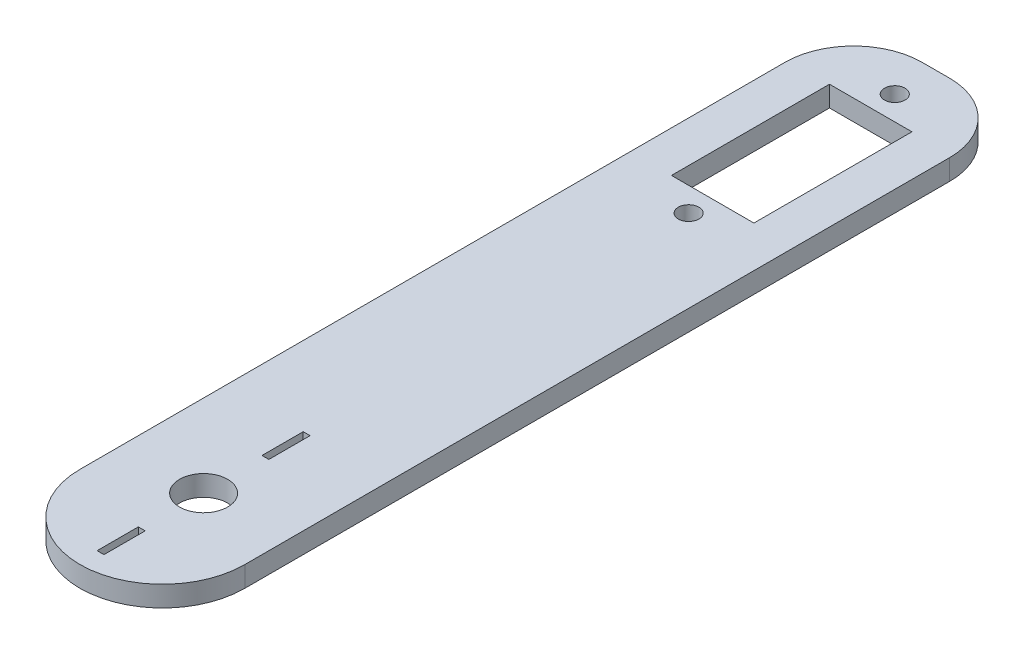
ISO-10303-21;
HEADER;
FILE_DESCRIPTION(('STEP AP214'),'2;1');
FILE_NAME('part.step','',(''),(''),'','','');
FILE_SCHEMA(('AUTOMOTIVE_DESIGN { 1 0 10303 214 1 1 1 1 }'));
ENDSEC;
DATA;
#1=APPLICATION_CONTEXT('core data for automotive mechanical design processes');
#2=APPLICATION_PROTOCOL_DEFINITION('international standard','automotive_design',2000,#1);
#3=PRODUCT_CONTEXT('',#1,'mechanical');
#4=PRODUCT('Part','Part','',(#3));
#5=PRODUCT_RELATED_PRODUCT_CATEGORY('part','',(#4));
#6=PRODUCT_DEFINITION_FORMATION('','',#4);
#7=PRODUCT_DEFINITION_CONTEXT('part definition',#1,'design');
#8=PRODUCT_DEFINITION('design','',#6,#7);
#9=PRODUCT_DEFINITION_SHAPE('','',#8);
#10=(LENGTH_UNIT() NAMED_UNIT(*) SI_UNIT(.MILLI.,.METRE.));
#11=(NAMED_UNIT(*) PLANE_ANGLE_UNIT() SI_UNIT($,.RADIAN.));
#12=(NAMED_UNIT(*) SI_UNIT($,.STERADIAN.) SOLID_ANGLE_UNIT());
#13=UNCERTAINTY_MEASURE_WITH_UNIT(LENGTH_MEASURE(1.E-05),#10,'distance_accuracy_value','');
#14=(GEOMETRIC_REPRESENTATION_CONTEXT(3) GLOBAL_UNCERTAINTY_ASSIGNED_CONTEXT((#13)) GLOBAL_UNIT_ASSIGNED_CONTEXT((#10,
#11,#12)) REPRESENTATION_CONTEXT('',''));
#15=CARTESIAN_POINT('',(0.,0.,0.));
#16=DIRECTION('',(0.,0.,1.));
#17=DIRECTION('',(1.,0.,0.));
#18=AXIS2_PLACEMENT_3D('',#15,#16,#17);
#19=CARTESIAN_POINT('',(-1.98737259774585,3.,-93.9666133181393));
#20=DIRECTION('',(0.,-1.,0.));
#21=DIRECTION('',(0.,0.,-1.));
#22=AXIS2_PLACEMENT_3D('',#19,#20,#21);
#23=CYLINDRICAL_SURFACE('',#22,9.99999999999995);
#24=CARTESIAN_POINT('',(-1.98737259774585,0.,-93.9666133181393));
#25=DIRECTION('',(0.,1.,0.));
#26=DIRECTION('',(0.,0.,1.));
#27=AXIS2_PLACEMENT_3D('',#24,#25,#26);
#28=CIRCLE('',#27,9.99999999999995);
#29=CARTESIAN_POINT('',(-11.9873725977458,0.,-93.9666133181393));
#30=VERTEX_POINT('',#29);
#31=CARTESIAN_POINT('',(-1.98737259774585,0.,-103.966613318139));
#32=VERTEX_POINT('',#31);
#33=EDGE_CURVE('E242',#30,#32,#28,.F.);
#34=ORIENTED_EDGE('',*,*,#33,.F.);
#35=DIRECTION('',(0.,-1.,0.));
#36=VECTOR('',#35,1.);
#37=CARTESIAN_POINT('',(-11.9873725977458,3.,-93.9666133181393));
#38=LINE('',#37,#36);
#39=CARTESIAN_POINT('',(-11.9873725977458,3.,-93.9666133181393));
#40=VERTEX_POINT('',#39);
#41=EDGE_CURVE('E11',#40,#30,#38,.T.);
#42=ORIENTED_EDGE('',*,*,#41,.F.);
#43=CARTESIAN_POINT('',(-1.98737259774585,3.,-93.9666133181393));
#44=DIRECTION('',(0.,1.,0.));
#45=DIRECTION('',(0.,0.,1.));
#46=AXIS2_PLACEMENT_3D('',#43,#44,#45);
#47=CIRCLE('',#46,9.99999999999995);
#48=CARTESIAN_POINT('',(-1.98737259774585,3.,-103.966613318139));
#49=VERTEX_POINT('',#48);
#50=EDGE_CURVE('E335',#40,#49,#47,.F.);
#51=ORIENTED_EDGE('',*,*,#50,.T.);
#52=DIRECTION('',(0.,-1.,0.));
#53=VECTOR('',#52,1.);
#54=CARTESIAN_POINT('',(-1.98737259774585,3.,-103.966613318139));
#55=LINE('',#54,#53);
#56=EDGE_CURVE('E55',#49,#32,#55,.T.);
#57=ORIENTED_EDGE('',*,*,#56,.T.);
#58=EDGE_LOOP('',(#34,#42,#51,#57));
#59=FACE_BOUND('',#58,.T.);
#60=ADVANCED_FACE('F36',(#59),#23,.T.);
#61=CARTESIAN_POINT('',(-11.9873725977458,3.,0.));
#62=DIRECTION('',(-1.,0.,0.));
#63=DIRECTION('',(0.,0.,1.));
#64=AXIS2_PLACEMENT_3D('',#61,#62,#63);
#65=PLANE('',#64);
#66=DIRECTION('',(0.,0.,-1.));
#67=VECTOR('',#66,1.);
#68=CARTESIAN_POINT('',(-11.9873725977458,0.,0.));
#69=LINE('',#68,#67);
#70=CARTESIAN_POINT('',(-11.9873725977458,0.,8.63338668188863));
#71=VERTEX_POINT('',#70);
#72=EDGE_CURVE('E244',#71,#30,#69,.T.);
#73=ORIENTED_EDGE('',*,*,#72,.F.);
#74=DIRECTION('',(0.,-1.,0.));
#75=VECTOR('',#74,1.);
#76=CARTESIAN_POINT('',(-11.9873725977458,3.,8.63338668188863));
#77=LINE('',#76,#75);
#78=CARTESIAN_POINT('',(-11.9873725977458,3.,8.63338668188863));
#79=VERTEX_POINT('',#78);
#80=EDGE_CURVE('E46',#79,#71,#77,.T.);
#81=ORIENTED_EDGE('',*,*,#80,.F.);
#82=DIRECTION('',(0.,0.,-1.));
#83=VECTOR('',#82,1.);
#84=CARTESIAN_POINT('',(-11.9873725977458,3.,0.));
#85=LINE('',#84,#83);
#86=EDGE_CURVE('E194',#79,#40,#85,.T.);
#87=ORIENTED_EDGE('',*,*,#86,.T.);
#88=ORIENTED_EDGE('',*,*,#41,.T.);
#89=EDGE_LOOP('',(#73,#81,#87,#88));
#90=FACE_BOUND('',#89,.T.);
#91=ADVANCED_FACE('F339',(#90),#65,.T.);
#92=CARTESIAN_POINT('',(0.0126274022262289,3.,8.63338668188863));
#93=DIRECTION('',(0.,-1.,0.));
#94=DIRECTION('',(0.,0.,-1.));
#95=AXIS2_PLACEMENT_3D('',#92,#93,#94);
#96=CYLINDRICAL_SURFACE('',#95,11.999999999972);
#97=CARTESIAN_POINT('',(0.0126274022262289,0.,8.63338668188863));
#98=DIRECTION('',(0.,1.,0.));
#99=DIRECTION('',(0.,0.,1.));
#100=AXIS2_PLACEMENT_3D('',#97,#98,#99);
#101=CIRCLE('',#100,11.999999999972);
#102=CARTESIAN_POINT('',(12.0126274021983,0.,8.63338668188863));
#103=VERTEX_POINT('',#102);
#104=EDGE_CURVE('E247',#71,#103,#101,.T.);
#105=ORIENTED_EDGE('',*,*,#104,.T.);
#106=DIRECTION('',(0.,-1.,0.));
#107=VECTOR('',#106,1.);
#108=CARTESIAN_POINT('',(12.0126274021983,3.,8.63338668188863));
#109=LINE('',#108,#107);
#110=CARTESIAN_POINT('',(12.0126274021983,3.,8.63338668188863));
#111=VERTEX_POINT('',#110);
#112=EDGE_CURVE('E178',#111,#103,#109,.T.);
#113=ORIENTED_EDGE('',*,*,#112,.F.);
#114=CARTESIAN_POINT('',(0.0126274022262289,3.,8.63338668188863));
#115=DIRECTION('',(0.,1.,0.));
#116=DIRECTION('',(0.,0.,1.));
#117=AXIS2_PLACEMENT_3D('',#114,#115,#116);
#118=CIRCLE('',#117,11.999999999972);
#119=EDGE_CURVE('E191',#79,#111,#118,.T.);
#120=ORIENTED_EDGE('',*,*,#119,.F.);
#121=ORIENTED_EDGE('',*,*,#80,.T.);
#122=EDGE_LOOP('',(#105,#113,#120,#121));
#123=FACE_BOUND('',#122,.T.);
#124=ADVANCED_FACE('F344',(#123),#96,.T.);
#125=CARTESIAN_POINT('',(12.0126274021983,3.,0.));
#126=DIRECTION('',(1.,0.,0.));
#127=DIRECTION('',(0.,0.,-1.));
#128=AXIS2_PLACEMENT_3D('',#125,#126,#127);
#129=PLANE('',#128);
#130=DIRECTION('',(0.,0.,1.));
#131=VECTOR('',#130,1.);
#132=CARTESIAN_POINT('',(12.0126274021983,0.,0.));
#133=LINE('',#132,#131);
#134=CARTESIAN_POINT('',(12.0126274021983,0.,-93.9666133181393));
#135=VERTEX_POINT('',#134);
#136=EDGE_CURVE('E175',#135,#103,#133,.T.);
#137=ORIENTED_EDGE('',*,*,#136,.F.);
#138=DIRECTION('',(0.,-1.,0.));
#139=VECTOR('',#138,1.);
#140=CARTESIAN_POINT('',(12.0126274021983,3.,-93.9666133181393));
#141=LINE('',#140,#139);
#142=CARTESIAN_POINT('',(12.0126274021983,3.,-93.9666133181393));
#143=VERTEX_POINT('',#142);
#144=EDGE_CURVE('E169',#143,#135,#141,.T.);
#145=ORIENTED_EDGE('',*,*,#144,.F.);
#146=DIRECTION('',(0.,0.,1.));
#147=VECTOR('',#146,1.);
#148=CARTESIAN_POINT('',(12.0126274021983,3.,0.));
#149=LINE('',#148,#147);
#150=EDGE_CURVE('E173',#143,#111,#149,.T.);
#151=ORIENTED_EDGE('',*,*,#150,.T.);
#152=ORIENTED_EDGE('',*,*,#112,.T.);
#153=EDGE_LOOP('',(#137,#145,#151,#152));
#154=FACE_BOUND('',#153,.T.);
#155=ADVANCED_FACE('F171',(#154),#129,.T.);
#156=CARTESIAN_POINT('',(2.01262740219831,3.,-93.9666133181393));
#157=DIRECTION('',(0.,-1.,0.));
#158=DIRECTION('',(0.,0.,-1.));
#159=AXIS2_PLACEMENT_3D('',#156,#157,#158);
#160=CYLINDRICAL_SURFACE('',#159,9.99999999999995);
#161=CARTESIAN_POINT('',(2.01262740219831,0.,-93.9666133181393));
#162=DIRECTION('',(0.,1.,0.));
#163=DIRECTION('',(0.,0.,1.));
#164=AXIS2_PLACEMENT_3D('',#161,#162,#163);
#165=CIRCLE('',#164,9.99999999999995);
#166=CARTESIAN_POINT('',(2.01262740219831,0.,-103.966613318139));
#167=VERTEX_POINT('',#166);
#168=EDGE_CURVE('E251',#135,#167,#165,.T.);
#169=ORIENTED_EDGE('',*,*,#168,.T.);
#170=DIRECTION('',(0.,-1.,0.));
#171=VECTOR('',#170,1.);
#172=CARTESIAN_POINT('',(2.01262740219831,3.,-103.966613318139));
#173=LINE('',#172,#171);
#174=CARTESIAN_POINT('',(2.01262740219831,3.,-103.966613318139));
#175=VERTEX_POINT('',#174);
#176=EDGE_CURVE('E111',#175,#167,#173,.T.);
#177=ORIENTED_EDGE('',*,*,#176,.F.);
#178=CARTESIAN_POINT('',(2.01262740219831,3.,-93.9666133181393));
#179=DIRECTION('',(0.,1.,0.));
#180=DIRECTION('',(0.,0.,1.));
#181=AXIS2_PLACEMENT_3D('',#178,#179,#180);
#182=CIRCLE('',#181,9.99999999999995);
#183=EDGE_CURVE('E180',#143,#175,#182,.T.);
#184=ORIENTED_EDGE('',*,*,#183,.F.);
#185=ORIENTED_EDGE('',*,*,#144,.T.);
#186=EDGE_LOOP('',(#169,#177,#184,#185));
#187=FACE_BOUND('',#186,.T.);
#188=ADVANCED_FACE('F181',(#187),#160,.T.);
#189=CARTESIAN_POINT('',(0.512627402254318,3.,0.));
#190=DIRECTION('',(1.,0.,0.));
#191=DIRECTION('',(0.,0.,-1.));
#192=AXIS2_PLACEMENT_3D('',#189,#190,#191);
#193=PLANE('',#192);
#194=DIRECTION('',(0.,0.,1.));
#195=VECTOR('',#194,1.);
#196=CARTESIAN_POINT('',(0.512627402254318,0.,0.));
#197=LINE('',#196,#195);
#198=CARTESIAN_POINT('',(0.512627402254318,0.,11.6333866818607));
#199=VERTEX_POINT('',#198);
#200=CARTESIAN_POINT('',(0.512627402254318,0.,17.6333866818607));
#201=VERTEX_POINT('',#200);
#202=EDGE_CURVE('E233',#199,#201,#197,.T.);
#203=ORIENTED_EDGE('',*,*,#202,.T.);
#204=DIRECTION('',(0.,-1.,0.));
#205=VECTOR('',#204,1.);
#206=CARTESIAN_POINT('',(0.512627402254318,3.,17.6333866818607));
#207=LINE('',#206,#205);
#208=CARTESIAN_POINT('',(0.512627402254318,3.,17.6333866818607));
#209=VERTEX_POINT('',#208);
#210=EDGE_CURVE('E261',#209,#201,#207,.T.);
#211=ORIENTED_EDGE('',*,*,#210,.F.);
#212=DIRECTION('',(0.,0.,1.));
#213=VECTOR('',#212,1.);
#214=CARTESIAN_POINT('',(0.512627402254318,3.,0.));
#215=LINE('',#214,#213);
#216=CARTESIAN_POINT('',(0.512627402254318,3.,11.6333866818607));
#217=VERTEX_POINT('',#216);
#218=EDGE_CURVE('E326',#217,#209,#215,.T.);
#219=ORIENTED_EDGE('',*,*,#218,.F.);
#220=DIRECTION('',(0.,-1.,0.));
#221=VECTOR('',#220,1.);
#222=CARTESIAN_POINT('',(0.512627402254318,3.,11.6333866818607));
#223=LINE('',#222,#221);
#224=EDGE_CURVE('E265',#217,#199,#223,.T.);
#225=ORIENTED_EDGE('',*,*,#224,.T.);
#226=EDGE_LOOP('',(#203,#211,#219,#225));
#227=FACE_BOUND('',#226,.T.);
#228=ADVANCED_FACE('F372',(#227),#193,.F.);
#229=CARTESIAN_POINT('',(0.,3.,17.6333866818607));
#230=DIRECTION('',(0.,0.,1.));
#231=DIRECTION('',(1.,0.,0.));
#232=AXIS2_PLACEMENT_3D('',#229,#230,#231);
#233=PLANE('',#232);
#234=DIRECTION('',(-1.,0.,0.));
#235=VECTOR('',#234,1.);
#236=CARTESIAN_POINT('',(0.,0.,17.6333866818607));
#237=LINE('',#236,#235);
#238=CARTESIAN_POINT('',(-0.487372597745681,0.,17.6333866818607));
#239=VERTEX_POINT('',#238);
#240=EDGE_CURVE('E236',#201,#239,#237,.T.);
#241=ORIENTED_EDGE('',*,*,#240,.T.);
#242=DIRECTION('',(0.,-1.,0.));
#243=VECTOR('',#242,1.);
#244=CARTESIAN_POINT('',(-0.487372597745681,3.,17.6333866818607));
#245=LINE('',#244,#243);
#246=CARTESIAN_POINT('',(-0.487372597745681,3.,17.6333866818607));
#247=VERTEX_POINT('',#246);
#248=EDGE_CURVE('E272',#247,#239,#245,.T.);
#249=ORIENTED_EDGE('',*,*,#248,.F.);
#250=DIRECTION('',(-1.,0.,0.));
#251=VECTOR('',#250,1.);
#252=CARTESIAN_POINT('',(0.,3.,17.6333866818607));
#253=LINE('',#252,#251);
#254=EDGE_CURVE('E329',#209,#247,#253,.T.);
#255=ORIENTED_EDGE('',*,*,#254,.F.);
#256=ORIENTED_EDGE('',*,*,#210,.T.);
#257=EDGE_LOOP('',(#241,#249,#255,#256));
#258=FACE_BOUND('',#257,.T.);
#259=ADVANCED_FACE('F368',(#258),#233,.F.);
#260=CARTESIAN_POINT('',(-0.487372597745681,3.,0.));
#261=DIRECTION('',(-1.,0.,0.));
#262=DIRECTION('',(0.,0.,1.));
#263=AXIS2_PLACEMENT_3D('',#260,#261,#262);
#264=PLANE('',#263);
#265=DIRECTION('',(0.,0.,-1.));
#266=VECTOR('',#265,1.);
#267=CARTESIAN_POINT('',(-0.487372597745681,0.,0.));
#268=LINE('',#267,#266);
#269=CARTESIAN_POINT('',(-0.487372597745681,0.,11.6333866818607));
#270=VERTEX_POINT('',#269);
#271=EDGE_CURVE('E238',#239,#270,#268,.T.);
#272=ORIENTED_EDGE('',*,*,#271,.T.);
#273=DIRECTION('',(0.,-1.,0.));
#274=VECTOR('',#273,1.);
#275=CARTESIAN_POINT('',(-0.487372597745681,3.,11.6333866818607));
#276=LINE('',#275,#274);
#277=CARTESIAN_POINT('',(-0.487372597745681,3.,11.6333866818607));
#278=VERTEX_POINT('',#277);
#279=EDGE_CURVE('E268',#278,#270,#276,.T.);
#280=ORIENTED_EDGE('',*,*,#279,.F.);
#281=DIRECTION('',(0.,0.,-1.));
#282=VECTOR('',#281,1.);
#283=CARTESIAN_POINT('',(-0.487372597745681,3.,0.));
#284=LINE('',#283,#282);
#285=EDGE_CURVE('E331',#247,#278,#284,.T.);
#286=ORIENTED_EDGE('',*,*,#285,.F.);
#287=ORIENTED_EDGE('',*,*,#248,.T.);
#288=EDGE_LOOP('',(#272,#280,#286,#287));
#289=FACE_BOUND('',#288,.T.);
#290=ADVANCED_FACE('F364',(#289),#264,.F.);
#291=CARTESIAN_POINT('',(0.,3.,-12.3666133181393));
#292=DIRECTION('',(0.,0.,1.));
#293=DIRECTION('',(1.,0.,0.));
#294=AXIS2_PLACEMENT_3D('',#291,#292,#293);
#295=PLANE('',#294);
#296=DIRECTION('',(-1.,0.,0.));
#297=VECTOR('',#296,1.);
#298=CARTESIAN_POINT('',(0.,0.,-12.3666133181393));
#299=LINE('',#298,#297);
#300=CARTESIAN_POINT('',(0.512627402254318,0.,-12.3666133181393));
#301=VERTEX_POINT('',#300);
#302=CARTESIAN_POINT('',(-0.487372597745681,0.,-12.3666133181393));
#303=VERTEX_POINT('',#302);
#304=EDGE_CURVE('E221',#301,#303,#299,.T.);
#305=ORIENTED_EDGE('',*,*,#304,.F.);
#306=DIRECTION('',(0.,-1.,0.));
#307=VECTOR('',#306,1.);
#308=CARTESIAN_POINT('',(0.512627402254318,3.,-12.3666133181393));
#309=LINE('',#308,#307);
#310=CARTESIAN_POINT('',(0.512627402254318,3.,-12.3666133181393));
#311=VERTEX_POINT('',#310);
#312=EDGE_CURVE('E269',#311,#301,#309,.T.);
#313=ORIENTED_EDGE('',*,*,#312,.F.);
#314=DIRECTION('',(-1.,0.,0.));
#315=VECTOR('',#314,1.);
#316=CARTESIAN_POINT('',(0.,3.,-12.3666133181393));
#317=LINE('',#316,#315);
#318=CARTESIAN_POINT('',(-0.487372597745681,3.,-12.3666133181393));
#319=VERTEX_POINT('',#318);
#320=EDGE_CURVE('E310',#311,#319,#317,.T.);
#321=ORIENTED_EDGE('',*,*,#320,.T.);
#322=DIRECTION('',(0.,-1.,0.));
#323=VECTOR('',#322,1.);
#324=CARTESIAN_POINT('',(-0.487372597745681,3.,-12.3666133181393));
#325=LINE('',#324,#323);
#326=EDGE_CURVE('E277',#319,#303,#325,.T.);
#327=ORIENTED_EDGE('',*,*,#326,.T.);
#328=EDGE_LOOP('',(#305,#313,#321,#327));
#329=FACE_BOUND('',#328,.T.);
#330=ADVANCED_FACE('F367',(#329),#295,.T.);
#331=CARTESIAN_POINT('',(0.512627402254318,3.,0.));
#332=DIRECTION('',(-1.,0.,0.));
#333=DIRECTION('',(0.,0.,1.));
#334=AXIS2_PLACEMENT_3D('',#331,#332,#333);
#335=PLANE('',#334);
#336=DIRECTION('',(0.,0.,-1.));
#337=VECTOR('',#336,1.);
#338=CARTESIAN_POINT('',(0.512627402254318,0.,0.));
#339=LINE('',#338,#337);
#340=CARTESIAN_POINT('',(0.512627402254318,0.,-6.36661331813933));
#341=VERTEX_POINT('',#340);
#342=EDGE_CURVE('E224',#341,#301,#339,.T.);
#343=ORIENTED_EDGE('',*,*,#342,.F.);
#344=DIRECTION('',(0.,-1.,0.));
#345=VECTOR('',#344,1.);
#346=CARTESIAN_POINT('',(0.512627402254318,3.,-6.36661331813933));
#347=LINE('',#346,#345);
#348=CARTESIAN_POINT('',(0.512627402254318,3.,-6.36661331813933));
#349=VERTEX_POINT('',#348);
#350=EDGE_CURVE('E281',#349,#341,#347,.T.);
#351=ORIENTED_EDGE('',*,*,#350,.F.);
#352=DIRECTION('',(0.,0.,-1.));
#353=VECTOR('',#352,1.);
#354=CARTESIAN_POINT('',(0.512627402254318,3.,0.));
#355=LINE('',#354,#353);
#356=EDGE_CURVE('E313',#349,#311,#355,.T.);
#357=ORIENTED_EDGE('',*,*,#356,.T.);
#358=ORIENTED_EDGE('',*,*,#312,.T.);
#359=EDGE_LOOP('',(#343,#351,#357,#358));
#360=FACE_BOUND('',#359,.T.);
#361=ADVANCED_FACE('F383',(#360),#335,.T.);
#362=CARTESIAN_POINT('',(0.,3.,-6.36661331813933));
#363=DIRECTION('',(0.,0.,-1.));
#364=DIRECTION('',(-1.,0.,0.));
#365=AXIS2_PLACEMENT_3D('',#362,#363,#364);
#366=PLANE('',#365);
#367=DIRECTION('',(1.,0.,0.));
#368=VECTOR('',#367,1.);
#369=CARTESIAN_POINT('',(0.,0.,-6.36661331813933));
#370=LINE('',#369,#368);
#371=CARTESIAN_POINT('',(-0.487372597745681,0.,-6.36661331813933));
#372=VERTEX_POINT('',#371);
#373=EDGE_CURVE('E227',#372,#341,#370,.T.);
#374=ORIENTED_EDGE('',*,*,#373,.F.);
#375=DIRECTION('',(0.,-1.,0.));
#376=VECTOR('',#375,1.);
#377=CARTESIAN_POINT('',(-0.487372597745681,3.,-6.36661331813933));
#378=LINE('',#377,#376);
#379=CARTESIAN_POINT('',(-0.487372597745681,3.,-6.36661331813933));
#380=VERTEX_POINT('',#379);
#381=EDGE_CURVE('E279',#380,#372,#378,.T.);
#382=ORIENTED_EDGE('',*,*,#381,.F.);
#383=DIRECTION('',(1.,0.,0.));
#384=VECTOR('',#383,1.);
#385=CARTESIAN_POINT('',(0.,3.,-6.36661331813933));
#386=LINE('',#385,#384);
#387=EDGE_CURVE('E320',#380,#349,#386,.T.);
#388=ORIENTED_EDGE('',*,*,#387,.T.);
#389=ORIENTED_EDGE('',*,*,#350,.T.);
#390=EDGE_LOOP('',(#374,#382,#388,#389));
#391=FACE_BOUND('',#390,.T.);
#392=ADVANCED_FACE('F380',(#391),#366,.T.);
#393=CARTESIAN_POINT('',(0.,3.,-94.4666133181393));
#394=DIRECTION('',(0.,0.,1.));
#395=DIRECTION('',(1.,0.,0.));
#396=AXIS2_PLACEMENT_3D('',#393,#394,#395);
#397=PLANE('',#396);
#398=DIRECTION('',(-1.,0.,0.));
#399=VECTOR('',#398,1.);
#400=CARTESIAN_POINT('',(0.,0.,-94.4666133181393));
#401=LINE('',#400,#399);
#402=CARTESIAN_POINT('',(6.0126274022517,0.,-94.4666133181393));
#403=VERTEX_POINT('',#402);
#404=CARTESIAN_POINT('',(-5.98737259774309,0.,-94.4666133181393));
#405=VERTEX_POINT('',#404);
#406=EDGE_CURVE('E209',#403,#405,#401,.T.);
#407=ORIENTED_EDGE('',*,*,#406,.F.);
#408=DIRECTION('',(0.,-1.,0.));
#409=VECTOR('',#408,1.);
#410=CARTESIAN_POINT('',(6.0126274022517,3.,-94.4666133181393));
#411=LINE('',#410,#409);
#412=CARTESIAN_POINT('',(6.0126274022517,3.,-94.4666133181393));
#413=VERTEX_POINT('',#412);
#414=EDGE_CURVE('E40',#413,#403,#411,.T.);
#415=ORIENTED_EDGE('',*,*,#414,.F.);
#416=DIRECTION('',(-1.,0.,0.));
#417=VECTOR('',#416,1.);
#418=CARTESIAN_POINT('',(0.,3.,-94.4666133181393));
#419=LINE('',#418,#417);
#420=CARTESIAN_POINT('',(-5.98737259774309,3.,-94.4666133181393));
#421=VERTEX_POINT('',#420);
#422=EDGE_CURVE('E599',#413,#421,#419,.T.);
#423=ORIENTED_EDGE('',*,*,#422,.T.);
#424=DIRECTION('',(0.,-1.,0.));
#425=VECTOR('',#424,1.);
#426=CARTESIAN_POINT('',(-5.98737259774309,3.,-94.4666133181393));
#427=LINE('',#426,#425);
#428=EDGE_CURVE('E202',#421,#405,#427,.T.);
#429=ORIENTED_EDGE('',*,*,#428,.T.);
#430=EDGE_LOOP('',(#407,#415,#423,#429));
#431=FACE_BOUND('',#430,.T.);
#432=ADVANCED_FACE('F296',(#431),#397,.T.);
#433=CARTESIAN_POINT('',(6.0126274022517,3.,0.));
#434=DIRECTION('',(-1.,0.,0.));
#435=DIRECTION('',(0.,0.,1.));
#436=AXIS2_PLACEMENT_3D('',#433,#434,#435);
#437=PLANE('',#436);
#438=DIRECTION('',(0.,0.,-1.));
#439=VECTOR('',#438,1.);
#440=CARTESIAN_POINT('',(6.0126274022517,0.,0.));
#441=LINE('',#440,#439);
#442=CARTESIAN_POINT('',(6.0126274022517,0.,-71.4666133181393));
#443=VERTEX_POINT('',#442);
#444=EDGE_CURVE('E212',#443,#403,#441,.T.);
#445=ORIENTED_EDGE('',*,*,#444,.F.);
#446=DIRECTION('',(0.,-1.,0.));
#447=VECTOR('',#446,1.);
#448=CARTESIAN_POINT('',(6.0126274022517,3.,-71.4666133181393));
#449=LINE('',#448,#447);
#450=CARTESIAN_POINT('',(6.0126274022517,3.,-71.4666133181393));
#451=VERTEX_POINT('',#450);
#452=EDGE_CURVE('E286',#451,#443,#449,.T.);
#453=ORIENTED_EDGE('',*,*,#452,.F.);
#454=DIRECTION('',(0.,0.,-1.));
#455=VECTOR('',#454,1.);
#456=CARTESIAN_POINT('',(6.0126274022517,3.,0.));
#457=LINE('',#456,#455);
#458=EDGE_CURVE('E295',#451,#413,#457,.T.);
#459=ORIENTED_EDGE('',*,*,#458,.T.);
#460=ORIENTED_EDGE('',*,*,#414,.T.);
#461=EDGE_LOOP('',(#445,#453,#459,#460));
#462=FACE_BOUND('',#461,.T.);
#463=ADVANCED_FACE('F293',(#462),#437,.T.);
#464=CARTESIAN_POINT('',(0.,3.,-71.4666133181393));
#465=DIRECTION('',(0.,0.,1.));
#466=DIRECTION('',(1.,0.,0.));
#467=AXIS2_PLACEMENT_3D('',#464,#465,#466);
#468=PLANE('',#467);
#469=DIRECTION('',(-1.,0.,0.));
#470=VECTOR('',#469,1.);
#471=CARTESIAN_POINT('',(0.,0.,-71.4666133181393));
#472=LINE('',#471,#470);
#473=CARTESIAN_POINT('',(-5.98737259774308,0.,-71.4666133181393));
#474=VERTEX_POINT('',#473);
#475=EDGE_CURVE('E215',#443,#474,#472,.T.);
#476=ORIENTED_EDGE('',*,*,#475,.T.);
#477=DIRECTION('',(0.,-1.,0.));
#478=VECTOR('',#477,1.);
#479=CARTESIAN_POINT('',(-5.98737259774308,3.,-71.4666133181393));
#480=LINE('',#479,#478);
#481=CARTESIAN_POINT('',(-5.98737259774308,3.,-71.4666133181393));
#482=VERTEX_POINT('',#481);
#483=EDGE_CURVE('E285',#482,#474,#480,.T.);
#484=ORIENTED_EDGE('',*,*,#483,.F.);
#485=DIRECTION('',(-1.,0.,0.));
#486=VECTOR('',#485,1.);
#487=CARTESIAN_POINT('',(0.,3.,-71.4666133181393));
#488=LINE('',#487,#486);
#489=EDGE_CURVE('E304',#451,#482,#488,.T.);
#490=ORIENTED_EDGE('',*,*,#489,.F.);
#491=ORIENTED_EDGE('',*,*,#452,.T.);
#492=EDGE_LOOP('',(#476,#484,#490,#491));
#493=FACE_BOUND('',#492,.T.);
#494=ADVANCED_FACE('F302',(#493),#468,.F.);
#495=CARTESIAN_POINT('',(-1.4428265987697E-12,3.,-103.966613318139));
#496=DIRECTION('',(0.,0.,-1.));
#497=DIRECTION('',(-1.,0.,0.));
#498=AXIS2_PLACEMENT_3D('',#495,#496,#497);
#499=PLANE('',#498);
#500=DIRECTION('',(1.,0.,0.));
#501=VECTOR('',#500,1.);
#502=CARTESIAN_POINT('',(-1.4428265987697E-12,0.,-103.966613318139));
#503=LINE('',#502,#501);
#504=EDGE_CURVE('E253',#32,#167,#503,.T.);
#505=ORIENTED_EDGE('',*,*,#504,.F.);
#506=ORIENTED_EDGE('',*,*,#56,.F.);
#507=DIRECTION('',(1.,0.,0.));
#508=VECTOR('',#507,1.);
#509=CARTESIAN_POINT('',(-1.4428265987697E-12,3.,-103.966613318139));
#510=LINE('',#509,#508);
#511=EDGE_CURVE('E184',#49,#175,#510,.T.);
#512=ORIENTED_EDGE('',*,*,#511,.T.);
#513=ORIENTED_EDGE('',*,*,#176,.T.);
#514=EDGE_LOOP('',(#505,#506,#512,#513));
#515=FACE_BOUND('',#514,.T.);
#516=ADVANCED_FACE('F362',(#515),#499,.T.);
#517=CARTESIAN_POINT('',(0.,3.,11.6333866818607));
#518=DIRECTION('',(0.,0.,-1.));
#519=DIRECTION('',(-1.,0.,0.));
#520=AXIS2_PLACEMENT_3D('',#517,#518,#519);
#521=PLANE('',#520);
#522=DIRECTION('',(1.,0.,0.));
#523=VECTOR('',#522,1.);
#524=CARTESIAN_POINT('',(0.,0.,11.6333866818607));
#525=LINE('',#524,#523);
#526=EDGE_CURVE('E240',#270,#199,#525,.T.);
#527=ORIENTED_EDGE('',*,*,#526,.T.);
#528=ORIENTED_EDGE('',*,*,#224,.F.);
#529=DIRECTION('',(1.,0.,0.));
#530=VECTOR('',#529,1.);
#531=CARTESIAN_POINT('',(0.,3.,11.6333866818607));
#532=LINE('',#531,#530);
#533=EDGE_CURVE('E333',#278,#217,#532,.T.);
#534=ORIENTED_EDGE('',*,*,#533,.F.);
#535=ORIENTED_EDGE('',*,*,#279,.T.);
#536=EDGE_LOOP('',(#527,#528,#534,#535));
#537=FACE_BOUND('',#536,.T.);
#538=ADVANCED_FACE('F358',(#537),#521,.F.);
#539=CARTESIAN_POINT('',(-0.487372597745681,3.,0.));
#540=DIRECTION('',(1.,0.,0.));
#541=DIRECTION('',(0.,0.,-1.));
#542=AXIS2_PLACEMENT_3D('',#539,#540,#541);
#543=PLANE('',#542);
#544=DIRECTION('',(0.,0.,1.));
#545=VECTOR('',#544,1.);
#546=CARTESIAN_POINT('',(-0.487372597745681,0.,0.));
#547=LINE('',#546,#545);
#548=EDGE_CURVE('E230',#303,#372,#547,.T.);
#549=ORIENTED_EDGE('',*,*,#548,.F.);
#550=ORIENTED_EDGE('',*,*,#326,.F.);
#551=DIRECTION('',(0.,0.,1.));
#552=VECTOR('',#551,1.);
#553=CARTESIAN_POINT('',(-0.487372597745681,3.,0.));
#554=LINE('',#553,#552);
#555=EDGE_CURVE('E323',#319,#380,#554,.T.);
#556=ORIENTED_EDGE('',*,*,#555,.T.);
#557=ORIENTED_EDGE('',*,*,#381,.T.);
#558=EDGE_LOOP('',(#549,#550,#556,#557));
#559=FACE_BOUND('',#558,.T.);
#560=ADVANCED_FACE('F361',(#559),#543,.T.);
#561=CARTESIAN_POINT('',(-5.98737259774304,3.,0.));
#562=DIRECTION('',(1.,0.,0.));
#563=DIRECTION('',(0.,0.,-1.));
#564=AXIS2_PLACEMENT_3D('',#561,#562,#563);
#565=PLANE('',#564);
#566=DIRECTION('',(0.,0.,1.));
#567=VECTOR('',#566,1.);
#568=CARTESIAN_POINT('',(-5.98737259774304,0.,0.));
#569=LINE('',#568,#567);
#570=EDGE_CURVE('E218',#405,#474,#569,.T.);
#571=ORIENTED_EDGE('',*,*,#570,.F.);
#572=ORIENTED_EDGE('',*,*,#428,.F.);
#573=DIRECTION('',(0.,0.,1.));
#574=VECTOR('',#573,1.);
#575=CARTESIAN_POINT('',(-5.98737259774304,3.,0.));
#576=LINE('',#575,#574);
#577=EDGE_CURVE('E307',#421,#482,#576,.T.);
#578=ORIENTED_EDGE('',*,*,#577,.T.);
#579=ORIENTED_EDGE('',*,*,#483,.T.);
#580=EDGE_LOOP('',(#571,#572,#578,#579));
#581=FACE_BOUND('',#580,.T.);
#582=ADVANCED_FACE('F308',(#581),#565,.T.);
#583=CARTESIAN_POINT('',(0.0126274022543189,3.,2.63338668186067));
#584=DIRECTION('',(0.,-1.,0.));
#585=DIRECTION('',(0.,0.,-1.));
#586=AXIS2_PLACEMENT_3D('',#583,#584,#585);
#587=CYLINDRICAL_SURFACE('',#586,3.5);
#588=CARTESIAN_POINT('',(0.0126274022543189,3.,2.63338668186067));
#589=DIRECTION('',(0.,1.,0.));
#590=DIRECTION('',(0.,0.,1.));
#591=AXIS2_PLACEMENT_3D('',#588,#589,#590);
#592=CIRCLE('',#591,3.5);
#593=CARTESIAN_POINT('',(0.0126274022543189,3.,6.13338668186067));
#594=VERTEX_POINT('',#593);
#595=EDGE_CURVE('E409',#594,#594,#592,.T.);
#596=ORIENTED_EDGE('',*,*,#595,.T.);
#597=EDGE_LOOP('',(#596));
#598=FACE_BOUND('',#597,.T.);
#599=CARTESIAN_POINT('',(0.0126274022543189,0.,2.63338668186067));
#600=DIRECTION('',(0.,1.,0.));
#601=DIRECTION('',(0.,0.,1.));
#602=AXIS2_PLACEMENT_3D('',#599,#600,#601);
#603=CIRCLE('',#602,3.5);
#604=CARTESIAN_POINT('',(0.0126274022543189,0.,6.13338668186067));
#605=VERTEX_POINT('',#604);
#606=EDGE_CURVE('E206',#605,#605,#603,.T.);
#607=ORIENTED_EDGE('',*,*,#606,.F.);
#608=EDGE_LOOP('',(#607));
#609=FACE_BOUND('',#608,.T.);
#610=ADVANCED_FACE('F393',(#598,#609),#587,.F.);
#611=CARTESIAN_POINT('',(0.0126274022544046,3.,-97.9666133181392));
#612=DIRECTION('',(0.,-1.,0.));
#613=DIRECTION('',(0.,0.,-1.));
#614=AXIS2_PLACEMENT_3D('',#611,#612,#613);
#615=CYLINDRICAL_SURFACE('',#614,1.50000000000003);
#616=CARTESIAN_POINT('',(0.0126274022544046,3.,-97.9666133181392));
#617=DIRECTION('',(0.,1.,0.));
#618=DIRECTION('',(0.,0.,1.));
#619=AXIS2_PLACEMENT_3D('',#616,#617,#618);
#620=CIRCLE('',#619,1.50000000000003);
#621=CARTESIAN_POINT('',(0.0126274022544046,3.,-96.4666133181391));
#622=VERTEX_POINT('',#621);
#623=EDGE_CURVE('E259',#622,#622,#620,.F.);
#624=ORIENTED_EDGE('',*,*,#623,.F.);
#625=EDGE_LOOP('',(#624));
#626=FACE_BOUND('',#625,.T.);
#627=CARTESIAN_POINT('',(0.0126274022544046,0.,-97.9666133181392));
#628=DIRECTION('',(0.,1.,0.));
#629=DIRECTION('',(0.,0.,1.));
#630=AXIS2_PLACEMENT_3D('',#627,#628,#629);
#631=CIRCLE('',#630,1.50000000000003);
#632=CARTESIAN_POINT('',(0.0126274022544046,0.,-96.4666133181391));
#633=VERTEX_POINT('',#632);
#634=EDGE_CURVE('E203',#633,#633,#631,.F.);
#635=ORIENTED_EDGE('',*,*,#634,.T.);
#636=EDGE_LOOP('',(#635));
#637=FACE_BOUND('',#636,.T.);
#638=ADVANCED_FACE('F38',(#626,#637),#615,.F.);
#639=CARTESIAN_POINT('',(0.0126274022536135,3.,-67.9667422946479));
#640=DIRECTION('',(0.,-1.,0.));
#641=DIRECTION('',(0.,0.,-1.));
#642=AXIS2_PLACEMENT_3D('',#639,#640,#641);
#643=CYLINDRICAL_SURFACE('',#642,1.50000000000001);
#644=CARTESIAN_POINT('',(0.0126274022536135,3.,-67.9667422946479));
#645=DIRECTION('',(0.,1.,0.));
#646=DIRECTION('',(0.,0.,1.));
#647=AXIS2_PLACEMENT_3D('',#644,#645,#646);
#648=CIRCLE('',#647,1.50000000000001);
#649=CARTESIAN_POINT('',(0.0126274022536135,3.,-66.4667422946479));
#650=VERTEX_POINT('',#649);
#651=EDGE_CURVE('E199',#650,#650,#648,.F.);
#652=ORIENTED_EDGE('',*,*,#651,.F.);
#653=EDGE_LOOP('',(#652));
#654=FACE_BOUND('',#653,.T.);
#655=CARTESIAN_POINT('',(0.0126274022536135,0.,-67.9667422946479));
#656=DIRECTION('',(0.,1.,0.));
#657=DIRECTION('',(0.,0.,1.));
#658=AXIS2_PLACEMENT_3D('',#655,#656,#657);
#659=CIRCLE('',#658,1.50000000000001);
#660=CARTESIAN_POINT('',(0.0126274022536135,0.,-66.4667422946479));
#661=VERTEX_POINT('',#660);
#662=EDGE_CURVE('E256',#661,#661,#659,.F.);
#663=ORIENTED_EDGE('',*,*,#662,.T.);
#664=EDGE_LOOP('',(#663));
#665=FACE_BOUND('',#664,.T.);
#666=ADVANCED_FACE('F404',(#654,#665),#643,.F.);
#667=CARTESIAN_POINT('',(0.,3.,0.));
#668=DIRECTION('',(0.,1.,0.));
#669=DIRECTION('',(0.,0.,1.));
#670=AXIS2_PLACEMENT_3D('',#667,#668,#669);
#671=PLANE('',#670);
#672=ORIENTED_EDGE('',*,*,#623,.T.);
#673=EDGE_LOOP('',(#672));
#674=FACE_BOUND('',#673,.T.);
#675=ORIENTED_EDGE('',*,*,#595,.F.);
#676=EDGE_LOOP('',(#675));
#677=FACE_BOUND('',#676,.T.);
#678=ORIENTED_EDGE('',*,*,#422,.F.);
#679=ORIENTED_EDGE('',*,*,#458,.F.);
#680=ORIENTED_EDGE('',*,*,#489,.T.);
#681=ORIENTED_EDGE('',*,*,#577,.F.);
#682=EDGE_LOOP('',(#678,#679,#680,#681));
#683=FACE_BOUND('',#682,.T.);
#684=ORIENTED_EDGE('',*,*,#320,.F.);
#685=ORIENTED_EDGE('',*,*,#356,.F.);
#686=ORIENTED_EDGE('',*,*,#387,.F.);
#687=ORIENTED_EDGE('',*,*,#555,.F.);
#688=EDGE_LOOP('',(#684,#685,#686,#687));
#689=FACE_BOUND('',#688,.T.);
#690=ORIENTED_EDGE('',*,*,#218,.T.);
#691=ORIENTED_EDGE('',*,*,#254,.T.);
#692=ORIENTED_EDGE('',*,*,#285,.T.);
#693=ORIENTED_EDGE('',*,*,#533,.T.);
#694=EDGE_LOOP('',(#690,#691,#692,#693));
#695=FACE_BOUND('',#694,.T.);
#696=ORIENTED_EDGE('',*,*,#50,.F.);
#697=ORIENTED_EDGE('',*,*,#86,.F.);
#698=ORIENTED_EDGE('',*,*,#119,.T.);
#699=ORIENTED_EDGE('',*,*,#150,.F.);
#700=ORIENTED_EDGE('',*,*,#183,.T.);
#701=ORIENTED_EDGE('',*,*,#511,.F.);
#702=EDGE_LOOP('',(#696,#697,#698,#699,#700,#701));
#703=FACE_BOUND('',#702,.T.);
#704=ORIENTED_EDGE('',*,*,#651,.T.);
#705=EDGE_LOOP('',(#704));
#706=FACE_BOUND('',#705,.T.);
#707=ADVANCED_FACE('F187',(#674,#677,#683,#689,#695,#703,#706),#671,.T.);
#708=CARTESIAN_POINT('',(0.,0.,0.));
#709=DIRECTION('',(0.,1.,0.));
#710=DIRECTION('',(0.,0.,1.));
#711=AXIS2_PLACEMENT_3D('',#708,#709,#710);
#712=PLANE('',#711);
#713=ORIENTED_EDGE('',*,*,#634,.F.);
#714=EDGE_LOOP('',(#713));
#715=FACE_BOUND('',#714,.T.);
#716=ORIENTED_EDGE('',*,*,#606,.T.);
#717=EDGE_LOOP('',(#716));
#718=FACE_BOUND('',#717,.T.);
#719=ORIENTED_EDGE('',*,*,#406,.T.);
#720=ORIENTED_EDGE('',*,*,#570,.T.);
#721=ORIENTED_EDGE('',*,*,#475,.F.);
#722=ORIENTED_EDGE('',*,*,#444,.T.);
#723=EDGE_LOOP('',(#719,#720,#721,#722));
#724=FACE_BOUND('',#723,.T.);
#725=ORIENTED_EDGE('',*,*,#304,.T.);
#726=ORIENTED_EDGE('',*,*,#548,.T.);
#727=ORIENTED_EDGE('',*,*,#373,.T.);
#728=ORIENTED_EDGE('',*,*,#342,.T.);
#729=EDGE_LOOP('',(#725,#726,#727,#728));
#730=FACE_BOUND('',#729,.T.);
#731=ORIENTED_EDGE('',*,*,#202,.F.);
#732=ORIENTED_EDGE('',*,*,#526,.F.);
#733=ORIENTED_EDGE('',*,*,#271,.F.);
#734=ORIENTED_EDGE('',*,*,#240,.F.);
#735=EDGE_LOOP('',(#731,#732,#733,#734));
#736=FACE_BOUND('',#735,.T.);
#737=ORIENTED_EDGE('',*,*,#33,.T.);
#738=ORIENTED_EDGE('',*,*,#504,.T.);
#739=ORIENTED_EDGE('',*,*,#168,.F.);
#740=ORIENTED_EDGE('',*,*,#136,.T.);
#741=ORIENTED_EDGE('',*,*,#104,.F.);
#742=ORIENTED_EDGE('',*,*,#72,.T.);
#743=EDGE_LOOP('',(#737,#738,#739,#740,#741,#742));
#744=FACE_BOUND('',#743,.T.);
#745=ORIENTED_EDGE('',*,*,#662,.F.);
#746=EDGE_LOOP('',(#745));
#747=FACE_BOUND('',#746,.T.);
#748=ADVANCED_FACE('F299',(#715,#718,#724,#730,#736,#744,#747),#712,.F.);
#749=CLOSED_SHELL('',(#60,#91,#124,#155,#188,#228,#259,#290,#330,#361,#392,#432,#463,#494,#516,
#538,#560,#582,#610,#638,#666,#707,#748));
#750=MANIFOLD_SOLID_BREP('B2',#749);
#751=ADVANCED_BREP_SHAPE_REPRESENTATION('',(#18,#750),#14);
#752=SHAPE_DEFINITION_REPRESENTATION(#9,#751);
ENDSEC;
END-ISO-10303-21;
